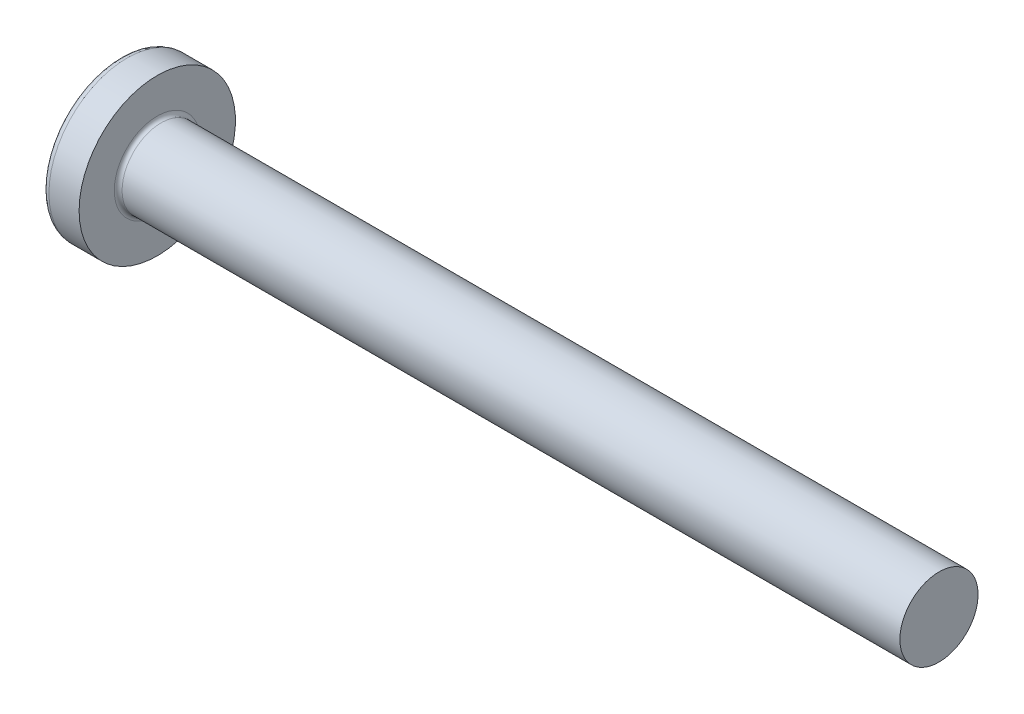
ISO-10303-21;
HEADER;
FILE_DESCRIPTION(('STEP AP214'),'2;1');
FILE_NAME('part.step','',(''),(''),'','','');
FILE_SCHEMA(('AUTOMOTIVE_DESIGN { 1 0 10303 214 1 1 1 1 }'));
ENDSEC;
DATA;
#1=APPLICATION_CONTEXT('core data for automotive mechanical design processes');
#2=APPLICATION_PROTOCOL_DEFINITION('international standard','automotive_design',2000,#1);
#3=PRODUCT_CONTEXT('',#1,'mechanical');
#4=PRODUCT('Part','Part','',(#3));
#5=PRODUCT_RELATED_PRODUCT_CATEGORY('part','',(#4));
#6=PRODUCT_DEFINITION_FORMATION('','',#4);
#7=PRODUCT_DEFINITION_CONTEXT('part definition',#1,'design');
#8=PRODUCT_DEFINITION('design','',#6,#7);
#9=PRODUCT_DEFINITION_SHAPE('','',#8);
#10=(LENGTH_UNIT() NAMED_UNIT(*) SI_UNIT(.MILLI.,.METRE.));
#11=(NAMED_UNIT(*) PLANE_ANGLE_UNIT() SI_UNIT($,.RADIAN.));
#12=(NAMED_UNIT(*) SI_UNIT($,.STERADIAN.) SOLID_ANGLE_UNIT());
#13=UNCERTAINTY_MEASURE_WITH_UNIT(LENGTH_MEASURE(1.E-05),#10,'distance_accuracy_value','');
#14=(GEOMETRIC_REPRESENTATION_CONTEXT(3) GLOBAL_UNCERTAINTY_ASSIGNED_CONTEXT((#13)) GLOBAL_UNIT_ASSIGNED_CONTEXT((#10,
#11,#12)) REPRESENTATION_CONTEXT('',''));
#15=CARTESIAN_POINT('',(0.,0.,0.));
#16=DIRECTION('',(0.,0.,1.));
#17=DIRECTION('',(1.,0.,0.));
#18=AXIS2_PLACEMENT_3D('',#15,#16,#17);
#19=CARTESIAN_POINT('',(6.5,0.,0.));
#20=DIRECTION('',(-1.,0.,0.));
#21=DIRECTION('',(0.,1.,0.));
#22=AXIS2_PLACEMENT_3D('',#19,#20,#21);
#23=SPHERICAL_SURFACE('',#22,6.5);
#24=CARTESIAN_POINT('',(1.26538895452803,0.,0.));
#25=DIRECTION('',(-1.,0.,0.));
#26=DIRECTION('',(0.,0.,1.));
#27=AXIS2_PLACEMENT_3D('',#24,#25,#26);
#28=CIRCLE('',#27,3.85342019543974);
#29=CARTESIAN_POINT('',(1.26538895452803,0.,3.85342019543974));
#30=VERTEX_POINT('',#29);
#31=EDGE_CURVE('E214',#30,#30,#28,.T.);
#32=ORIENTED_EDGE('',*,*,#31,.T.);
#33=EDGE_LOOP('',(#32));
#34=FACE_BOUND('',#33,.T.);
#35=CARTESIAN_POINT('',(0.0788099820016241,0.,0.));
#36=DIRECTION('',(1.,0.,0.));
#37=DIRECTION('',(0.,0.,-1.));
#38=AXIS2_PLACEMENT_3D('',#35,#36,#37);
#39=CIRCLE('',#38,1.0091178091571);
#40=CARTESIAN_POINT('',(0.0788099820016251,-0.514999999999997,-0.867809744562727));
#41=VERTEX_POINT('',#40);
#42=CARTESIAN_POINT('',(0.0788099820016241,-0.867809744562722,-0.515));
#43=VERTEX_POINT('',#42);
#44=EDGE_CURVE('E341',#41,#43,#39,.F.);
#45=ORIENTED_EDGE('',*,*,#44,.F.);
#46=CARTESIAN_POINT('',(6.5,-0.515,0.));
#47=DIRECTION('',(0.,1.,0.));
#48=DIRECTION('',(0.,0.,1.));
#49=AXIS2_PLACEMENT_3D('',#46,#47,#48);
#50=CIRCLE('',#49,6.47956595768575);
#51=CARTESIAN_POINT('',(0.331830520157854,-0.514999999999993,-1.98455543332603));
#52=VERTEX_POINT('',#51);
#53=EDGE_CURVE('E274',#52,#41,#50,.T.);
#54=ORIENTED_EDGE('',*,*,#53,.F.);
#55=CARTESIAN_POINT('',(6.06443225879603,0.,0.873613881878153));
#56=DIRECTION('',(0.446197753347436,0.,-0.894934391398443));
#57=DIRECTION('',(-0.894934391398442,0.,-0.446197753347436));
#58=AXIS2_PLACEMENT_3D('',#55,#56,#57);
#59=CIRCLE('',#58,6.42628038045433);
#60=CARTESIAN_POINT('',(0.331830520157854,0.515000000000007,-1.98455543332603));
#61=VERTEX_POINT('',#60);
#62=EDGE_CURVE('E248',#52,#61,#59,.T.);
#63=ORIENTED_EDGE('',*,*,#62,.T.);
#64=CARTESIAN_POINT('',(6.5,0.515,0.));
#65=DIRECTION('',(0.,-1.,0.));
#66=DIRECTION('',(0.,0.,-1.));
#67=AXIS2_PLACEMENT_3D('',#64,#65,#66);
#68=CIRCLE('',#67,6.47956595768575);
#69=CARTESIAN_POINT('',(0.0788099820016249,0.515000000000003,-0.867809744562724));
#70=VERTEX_POINT('',#69);
#71=EDGE_CURVE('E303',#70,#61,#68,.T.);
#72=ORIENTED_EDGE('',*,*,#71,.F.);
#73=CARTESIAN_POINT('',(0.0788099820016241,0.867809744562721,-0.515));
#74=VERTEX_POINT('',#73);
#75=EDGE_CURVE('E356',#74,#70,#39,.F.);
#76=ORIENTED_EDGE('',*,*,#75,.F.);
#77=CARTESIAN_POINT('',(6.5,0.,-0.515));
#78=DIRECTION('',(0.,0.,1.));
#79=DIRECTION('',(1.,0.,0.));
#80=AXIS2_PLACEMENT_3D('',#77,#78,#79);
#81=CIRCLE('',#80,6.47956595768575);
#82=CARTESIAN_POINT('',(0.331830520157856,1.98455543332603,-0.515));
#83=VERTEX_POINT('',#82);
#84=EDGE_CURVE('E242',#83,#74,#81,.T.);
#85=ORIENTED_EDGE('',*,*,#84,.F.);
#86=CARTESIAN_POINT('',(6.06443225879604,-0.873613881878154,0.));
#87=DIRECTION('',(0.446197753347436,0.894934391398443,0.));
#88=DIRECTION('',(-0.894934391398442,0.446197753347436,0.));
#89=AXIS2_PLACEMENT_3D('',#86,#87,#88);
#90=CIRCLE('',#89,6.42628038045433);
#91=CARTESIAN_POINT('',(0.331830520157856,1.98455543332603,0.515));
#92=VERTEX_POINT('',#91);
#93=EDGE_CURVE('E245',#83,#92,#90,.T.);
#94=ORIENTED_EDGE('',*,*,#93,.T.);
#95=CARTESIAN_POINT('',(6.5,0.,0.515));
#96=DIRECTION('',(0.,0.,-1.));
#97=DIRECTION('',(0.,1.,0.));
#98=AXIS2_PLACEMENT_3D('',#95,#96,#97);
#99=CIRCLE('',#98,6.47956595768575);
#100=CARTESIAN_POINT('',(0.0788099820016241,0.867809744562721,0.515));
#101=VERTEX_POINT('',#100);
#102=EDGE_CURVE('E238',#101,#92,#99,.T.);
#103=ORIENTED_EDGE('',*,*,#102,.F.);
#104=CARTESIAN_POINT('',(0.0788099820016251,0.514999999999997,0.867809744562727));
#105=VERTEX_POINT('',#104);
#106=EDGE_CURVE('E355',#105,#101,#39,.F.);
#107=ORIENTED_EDGE('',*,*,#106,.F.);
#108=CARTESIAN_POINT('',(0.331830520157856,0.514999999999993,1.98455543332603));
#109=VERTEX_POINT('',#108);
#110=EDGE_CURVE('E258',#109,#105,#68,.T.);
#111=ORIENTED_EDGE('',*,*,#110,.F.);
#112=CARTESIAN_POINT('',(6.06443225879603,0.,-0.873613881878153));
#113=DIRECTION('',(0.446197753347436,0.,0.894934391398443));
#114=DIRECTION('',(0.894934391398442,0.,-0.446197753347436));
#115=AXIS2_PLACEMENT_3D('',#112,#113,#114);
#116=CIRCLE('',#115,6.42628038045433);
#117=CARTESIAN_POINT('',(0.331830520157856,-0.515000000000007,1.98455543332603));
#118=VERTEX_POINT('',#117);
#119=EDGE_CURVE('E49',#109,#118,#116,.T.);
#120=ORIENTED_EDGE('',*,*,#119,.T.);
#121=CARTESIAN_POINT('',(0.0788099820016253,-0.515000000000003,0.867809744562724));
#122=VERTEX_POINT('',#121);
#123=EDGE_CURVE('E255',#122,#118,#50,.T.);
#124=ORIENTED_EDGE('',*,*,#123,.F.);
#125=CARTESIAN_POINT('',(0.0788099820016241,-0.867809744562722,0.515));
#126=VERTEX_POINT('',#125);
#127=EDGE_CURVE('E391',#126,#122,#39,.F.);
#128=ORIENTED_EDGE('',*,*,#127,.F.);
#129=CARTESIAN_POINT('',(0.331830520157854,-1.98455543332603,0.515));
#130=VERTEX_POINT('',#129);
#131=EDGE_CURVE('E239',#130,#126,#99,.T.);
#132=ORIENTED_EDGE('',*,*,#131,.F.);
#133=CARTESIAN_POINT('',(6.06443225879603,0.873613881878153,0.));
#134=DIRECTION('',(0.446197753347436,-0.894934391398443,0.));
#135=DIRECTION('',(0.894934391398442,0.446197753347436,0.));
#136=AXIS2_PLACEMENT_3D('',#133,#134,#135);
#137=CIRCLE('',#136,6.42628038045433);
#138=CARTESIAN_POINT('',(0.331830520157854,-1.98455543332603,-0.515));
#139=VERTEX_POINT('',#138);
#140=EDGE_CURVE('E235',#130,#139,#137,.T.);
#141=ORIENTED_EDGE('',*,*,#140,.T.);
#142=EDGE_CURVE('E64',#43,#139,#81,.T.);
#143=ORIENTED_EDGE('',*,*,#142,.F.);
#144=EDGE_LOOP('',(#45,#54,#63,#72,#76,#85,#94,#103,#107,#111,#120,#124,#128,#132,#141,#143));
#145=FACE_BOUND('',#144,.T.);
#146=ADVANCED_FACE('F35',(#34,#145),#23,.T.);
#147=CARTESIAN_POINT('',(0.,2.15,-0.515));
#148=DIRECTION('',(0.,0.,1.));
#149=DIRECTION('',(1.,0.,0.));
#150=AXIS2_PLACEMENT_3D('',#147,#148,#149);
#151=PLANE('',#150);
#152=ORIENTED_EDGE('',*,*,#84,.T.);
#153=CARTESIAN_POINT('',(-1.51195208675156,0.994972220320187,-0.515));
#154=CARTESIAN_POINT('',(-1.20405981949279,0.970722016949957,-0.515));
#155=CARTESIAN_POINT('',(-0.896180907521174,0.94629910991965,-0.515));
#156=CARTESIAN_POINT('',(-0.280449079832185,0.896981122427851,-0.515));
#157=CARTESIAN_POINT('',(0.0274038344396872,0.872086023934882,-0.515));
#158=CARTESIAN_POINT('',(0.489146739515351,0.83429553519528,-0.515));
#159=CARTESIAN_POINT('',(0.643055047553846,0.821624058404092,-0.515));
#160=CARTESIAN_POINT('',(0.950856520197141,0.796108332639504,-0.515));
#161=CARTESIAN_POINT('',(1.10474968487868,0.783264084592465,-0.515));
#162=CARTESIAN_POINT('',(1.41251352095103,0.757376569093378,-0.515));
#163=CARTESIAN_POINT('',(1.56638419296577,0.744333309065218,-0.515));
#164=CARTESIAN_POINT('',(1.87410847343335,0.718013273188896,-0.515));
#165=CARTESIAN_POINT('',(2.02796208151372,0.704736492982792,-0.515));
#166=CARTESIAN_POINT('',(2.36455311890989,0.675386943006726,-0.515));
#167=CARTESIAN_POINT('',(2.54728562293342,0.659257575640986,-0.515));
#168=CARTESIAN_POINT('',(2.91270624109256,0.626517182479888,-0.515));
#169=CARTESIAN_POINT('',(3.09539435554037,0.609906160177238,-0.515));
#170=CARTESIAN_POINT('',(3.46069832191612,0.576073027116422,-0.515));
#171=CARTESIAN_POINT('',(3.64331417870068,0.558850968932728,-0.515));
#172=CARTESIAN_POINT('',(4.00847437496567,0.523604864540038,-0.515));
#173=CARTESIAN_POINT('',(4.19101871216888,0.505580794604253,-0.515));
#174=CARTESIAN_POINT('',(4.55606208157937,0.468429191666488,-0.515));
#175=CARTESIAN_POINT('',(4.73856107358022,0.449301262281854,-0.515));
#176=CARTESIAN_POINT('',(5.10337547353418,0.409473604748925,-0.515));
#177=CARTESIAN_POINT('',(5.28569089526422,0.38877400510607,-0.515));
#178=CARTESIAN_POINT('',(5.55897278495412,0.355828287527265,-0.515));
#179=CARTESIAN_POINT('',(5.65005277419686,0.344527918782739,-0.515));
#180=CARTESIAN_POINT('',(5.83209904103607,0.321075174263032,-0.515));
#181=CARTESIAN_POINT('',(5.92306532397915,0.308922840209687,-0.515));
#182=CARTESIAN_POINT('',(6.10486078872898,0.283427334451931,-0.515));
#183=CARTESIAN_POINT('',(6.19568992299379,0.270083817601715,-0.515));
#184=CARTESIAN_POINT('',(6.33172773785679,0.248701420809952,-0.515));
#185=CARTESIAN_POINT('',(6.37704304473344,0.241345446705305,-0.515));
#186=CARTESIAN_POINT('',(6.4675722520141,0.226018953559339,-0.515));
#187=CARTESIAN_POINT('',(6.51278614568083,0.218048394864477,-0.515));
#188=CARTESIAN_POINT('',(6.55793125759548,0.209691465274946,-0.515));
#189=B_SPLINE_CURVE_WITH_KNOTS('',3,(#153,#154,#155,#156,#157,#158,#159,#160,#161,#162,#163,
#164,#165,#166,#167,#168,#169,#170,#171,#172,#173,#174,#175,#176,#177,#178,#179,#180,#181,#182,
#183,#184,#185,#186,#187,#188),.UNSPECIFIED.,.F.,.F.,(4,2,2,2,2,2,2,2,2,2,2,2,2,2,2,2,2,4),(0.,
0.92653770978172,1.85311087258339,2.31639796016285,2.77968256468771,3.24294992902054,
3.70622594801777,4.25655436065378,4.80687878359543,5.35715597005738,5.90744944680717,
6.45794177197673,7.00838913527399,7.28372117336898,7.55903973750591,7.83443833587748,
7.97216007460854,8.10989070671571),.UNSPECIFIED.);
#190=CARTESIAN_POINT('',(2.34,0.677477674908923,-0.515));
#191=VERTEX_POINT('',#190);
#192=EDGE_CURVE('E378',#74,#191,#189,.T.);
#193=ORIENTED_EDGE('',*,*,#192,.T.);
#194=DIRECTION('',(0.,1.,0.));
#195=VECTOR('',#194,1.);
#196=CARTESIAN_POINT('',(2.34,-0.983319232260742,-0.515));
#197=LINE('',#196,#195);
#198=CARTESIAN_POINT('',(2.34,0.983319232260743,-0.515));
#199=VERTEX_POINT('',#198);
#200=EDGE_CURVE('E324',#191,#199,#197,.T.);
#201=ORIENTED_EDGE('',*,*,#200,.T.);
#202=DIRECTION('',(0.894934391398442,-0.446197753347436,0.));
#203=VECTOR('',#202,1.);
#204=CARTESIAN_POINT('',(0.,2.15,-0.515));
#205=LINE('',#204,#203);
#206=EDGE_CURVE('E215',#83,#199,#205,.T.);
#207=ORIENTED_EDGE('',*,*,#206,.F.);
#208=EDGE_LOOP('',(#152,#193,#201,#207));
#209=FACE_BOUND('',#208,.T.);
#210=ADVANCED_FACE('F170',(#209),#151,.T.);
#211=CARTESIAN_POINT('',(2.34,-0.983319232260742,-0.515));
#212=VERTEX_POINT('',#211);
#213=CARTESIAN_POINT('',(2.34,-0.677477674908923,-0.515));
#214=VERTEX_POINT('',#213);
#215=EDGE_CURVE('E223',#212,#214,#197,.T.);
#216=ORIENTED_EDGE('',*,*,#215,.T.);
#217=CARTESIAN_POINT('',(-1.51195208675156,-0.994972220320187,-0.515));
#218=CARTESIAN_POINT('',(-1.20405981949279,-0.970722016949957,-0.515));
#219=CARTESIAN_POINT('',(-0.896180907521174,-0.94629910991965,-0.515));
#220=CARTESIAN_POINT('',(-0.280449079832185,-0.896981122427851,-0.515));
#221=CARTESIAN_POINT('',(0.0274038344396872,-0.872086023934882,-0.515));
#222=CARTESIAN_POINT('',(0.489146739515351,-0.83429553519528,-0.515));
#223=CARTESIAN_POINT('',(0.643055047553846,-0.821624058404092,-0.515));
#224=CARTESIAN_POINT('',(0.950856520197141,-0.796108332639504,-0.515));
#225=CARTESIAN_POINT('',(1.10474968487868,-0.783264084592465,-0.515));
#226=CARTESIAN_POINT('',(1.41251352095103,-0.757376569093378,-0.515));
#227=CARTESIAN_POINT('',(1.56638419296577,-0.744333309065218,-0.515));
#228=CARTESIAN_POINT('',(1.87410847343335,-0.718013273188896,-0.515));
#229=CARTESIAN_POINT('',(2.02796208151372,-0.704736492982792,-0.515));
#230=CARTESIAN_POINT('',(2.36455311890989,-0.675386943006726,-0.515));
#231=CARTESIAN_POINT('',(2.54728562293342,-0.659257575640986,-0.515));
#232=CARTESIAN_POINT('',(2.91270624109256,-0.626517182479888,-0.515));
#233=CARTESIAN_POINT('',(3.09539435554038,-0.609906160177238,-0.515));
#234=CARTESIAN_POINT('',(3.46069832191613,-0.576073027116421,-0.515));
#235=CARTESIAN_POINT('',(3.64331417870068,-0.558850968932727,-0.515));
#236=CARTESIAN_POINT('',(4.00847437496567,-0.523604864540037,-0.515));
#237=CARTESIAN_POINT('',(4.19101871216888,-0.505580794604253,-0.515));
#238=CARTESIAN_POINT('',(4.55606208157937,-0.468429191666488,-0.515));
#239=CARTESIAN_POINT('',(4.73856107358023,-0.449301262281854,-0.515));
#240=CARTESIAN_POINT('',(5.10337547353419,-0.409473604748925,-0.515));
#241=CARTESIAN_POINT('',(5.28569089526422,-0.38877400510607,-0.515));
#242=CARTESIAN_POINT('',(5.55897278495412,-0.355828287527264,-0.515));
#243=CARTESIAN_POINT('',(5.65005277419686,-0.344527918782738,-0.515));
#244=CARTESIAN_POINT('',(5.83209904103608,-0.321075174263031,-0.515));
#245=CARTESIAN_POINT('',(5.92306532397915,-0.308922840209686,-0.515));
#246=CARTESIAN_POINT('',(6.10486078872898,-0.283427334451931,-0.515));
#247=CARTESIAN_POINT('',(6.1956899229938,-0.270083817601715,-0.515));
#248=CARTESIAN_POINT('',(6.33172773785679,-0.248701420809952,-0.515));
#249=CARTESIAN_POINT('',(6.37704304473344,-0.241345446705305,-0.515));
#250=CARTESIAN_POINT('',(6.4675722520141,-0.226018953559339,-0.515));
#251=CARTESIAN_POINT('',(6.51278614568083,-0.218048394864477,-0.515));
#252=CARTESIAN_POINT('',(6.55793125759549,-0.209691465274945,-0.515));
#253=B_SPLINE_CURVE_WITH_KNOTS('',3,(#217,#218,#219,#220,#221,#222,#223,#224,#225,#226,#227,
#228,#229,#230,#231,#232,#233,#234,#235,#236,#237,#238,#239,#240,#241,#242,#243,#244,#245,#246,
#247,#248,#249,#250,#251,#252),.UNSPECIFIED.,.F.,.F.,(4,2,2,2,2,2,2,2,2,2,2,2,2,2,2,2,2,4),(0.,
0.92653770978172,1.85311087258339,2.31639796016285,2.77968256468771,3.24294992902054,
3.70622594801777,4.25655436065378,4.80687878359543,5.35715597005738,5.90744944680718,
6.45794177197673,7.008389135274,7.28372117336899,7.55903973750591,7.83443833587748,
7.97216007460854,8.10989070671571),.UNSPECIFIED.);
#254=EDGE_CURVE('E354',#214,#43,#253,.F.);
#255=ORIENTED_EDGE('',*,*,#254,.T.);
#256=ORIENTED_EDGE('',*,*,#142,.T.);
#257=DIRECTION('',(0.894934391398442,0.446197753347436,0.));
#258=VECTOR('',#257,1.);
#259=CARTESIAN_POINT('',(0.,-2.15,-0.515));
#260=LINE('',#259,#258);
#261=EDGE_CURVE('E306',#139,#212,#260,.T.);
#262=ORIENTED_EDGE('',*,*,#261,.T.);
#263=EDGE_LOOP('',(#216,#255,#256,#262));
#264=FACE_BOUND('',#263,.T.);
#265=ADVANCED_FACE('F176',(#264),#151,.T.);
#266=CARTESIAN_POINT('',(0.,-2.15,0.515));
#267=DIRECTION('',(0.,0.,-1.));
#268=DIRECTION('',(0.,1.,0.));
#269=AXIS2_PLACEMENT_3D('',#266,#267,#268);
#270=PLANE('',#269);
#271=DIRECTION('',(0.,-1.,0.));
#272=VECTOR('',#271,1.);
#273=CARTESIAN_POINT('',(2.34,0.983319232260742,0.515));
#274=LINE('',#273,#272);
#275=CARTESIAN_POINT('',(2.34,0.983319232260743,0.515));
#276=VERTEX_POINT('',#275);
#277=CARTESIAN_POINT('',(2.34,0.677477674908923,0.515));
#278=VERTEX_POINT('',#277);
#279=EDGE_CURVE('E314',#276,#278,#274,.T.);
#280=ORIENTED_EDGE('',*,*,#279,.T.);
#281=CARTESIAN_POINT('',(-1.51195208754037,0.994972220382297,0.515));
#282=CARTESIAN_POINT('',(-1.20405982018868,0.970722017005064,0.515));
#283=CARTESIAN_POINT('',(-0.896180908124144,0.946299109967688,0.515));
#284=CARTESIAN_POINT('',(-0.280449080249312,0.896981122461527,0.515));
#285=CARTESIAN_POINT('',(0.0274038341154851,0.872086023961265,0.515));
#286=CARTESIAN_POINT('',(0.489146739371409,0.834295535207136,0.515));
#287=CARTESIAN_POINT('',(0.643055047497245,0.821624058408796,0.515));
#288=CARTESIAN_POINT('',(0.950856520315204,0.796108332629705,0.515));
#289=CARTESIAN_POINT('',(1.10474968508407,0.783264084575317,0.515));
#290=CARTESIAN_POINT('',(1.41251352133103,0.757376569061287,0.515));
#291=CARTESIAN_POINT('',(1.56638419343305,0.744333309025534,0.515));
#292=CARTESIAN_POINT('',(1.87410847407519,0.718013273133716,0.515));
#293=CARTESIAN_POINT('',(2.02796208224283,0.70473649291971,0.515));
#294=CARTESIAN_POINT('',(2.36455311972626,0.675386942934956,0.515));
#295=CARTESIAN_POINT('',(2.5472856237498,0.659257575568568,0.515));
#296=CARTESIAN_POINT('',(2.91270624190895,0.626517182406014,0.515));
#297=CARTESIAN_POINT('',(3.09539435635676,0.609906160102555,0.515));
#298=CARTESIAN_POINT('',(3.46069832273244,0.57607302703989,0.515));
#299=CARTESIAN_POINT('',(3.64331417951694,0.558850968855157,0.515));
#300=CARTESIAN_POINT('',(4.00847437578178,0.523604864460044,0.515));
#301=CARTESIAN_POINT('',(4.1910187129849,0.505580794522876,0.515));
#302=CARTESIAN_POINT('',(4.55606208239526,0.46842919158178,0.515));
#303=CARTESIAN_POINT('',(4.73856107439606,0.449301262195198,0.515));
#304=CARTESIAN_POINT('',(5.10337547434977,0.409473604657436,0.515));
#305=CARTESIAN_POINT('',(5.2856908960796,0.388774005011695,0.515));
#306=CARTESIAN_POINT('',(5.55897278576906,0.355828287427083,0.515));
#307=CARTESIAN_POINT('',(5.65005277501166,0.344527918680369,0.515));
#308=CARTESIAN_POINT('',(5.83209904185046,0.321075174155501,0.515));
#309=CARTESIAN_POINT('',(5.92306532479326,0.308922840099182,0.515));
#310=CARTESIAN_POINT('',(6.10486078954238,0.283427334334154,0.515));
#311=CARTESIAN_POINT('',(6.19568992380676,0.270083817479638,0.515));
#312=CARTESIAN_POINT('',(6.33172773866873,0.24870142067948,0.515));
#313=CARTESIAN_POINT('',(6.37704304554499,0.241345446571708,0.515));
#314=CARTESIAN_POINT('',(6.46757225282465,0.226018953418425,0.515));
#315=CARTESIAN_POINT('',(6.51278614649077,0.21804839471937,0.515));
#316=CARTESIAN_POINT('',(6.55793125840465,0.209691465124903,0.515));
#317=B_SPLINE_CURVE_WITH_KNOTS('',3,(#281,#282,#283,#284,#285,#286,#287,#288,#289,#290,#291,
#292,#293,#294,#295,#296,#297,#298,#299,#300,#301,#302,#303,#304,#305,#306,#307,#308,#309,#310,
#311,#312,#313,#314,#315,#316),.UNSPECIFIED.,.F.,.F.,(4,2,2,2,2,2,2,2,2,2,2,2,2,2,2,2,2,4),(0.,
0.926537710061277,1.85311087314258,2.31639796098494,2.77968256577269,3.24294993036838,
3.70622594962848,4.25655436226469,4.80687878520654,5.3571559716686,5.90744944841854,
6.45794177358856,7.00838913688618,7.28372117498156,7.55903973911884,7.83443833749096,
7.97216007622235,8.10989070832989),.UNSPECIFIED.);
#318=EDGE_CURVE('E279',#278,#101,#317,.F.);
#319=ORIENTED_EDGE('',*,*,#318,.T.);
#320=ORIENTED_EDGE('',*,*,#102,.T.);
#321=DIRECTION('',(0.894934391398442,-0.446197753347436,0.));
#322=VECTOR('',#321,1.);
#323=CARTESIAN_POINT('',(0.,2.15,0.515));
#324=LINE('',#323,#322);
#325=EDGE_CURVE('E220',#92,#276,#324,.T.);
#326=ORIENTED_EDGE('',*,*,#325,.T.);
#327=EDGE_LOOP('',(#280,#319,#320,#326));
#328=FACE_BOUND('',#327,.T.);
#329=ADVANCED_FACE('F374',(#328),#270,.T.);
#330=ORIENTED_EDGE('',*,*,#131,.T.);
#331=CARTESIAN_POINT('',(-1.51195208754037,-0.994972220382297,0.515));
#332=CARTESIAN_POINT('',(-1.20405982018868,-0.970722017005064,0.515));
#333=CARTESIAN_POINT('',(-0.896180908124144,-0.946299109967688,0.515));
#334=CARTESIAN_POINT('',(-0.280449080249312,-0.896981122461527,0.515));
#335=CARTESIAN_POINT('',(0.0274038341154852,-0.872086023961264,0.515));
#336=CARTESIAN_POINT('',(0.489146739371408,-0.834295535207136,0.515));
#337=CARTESIAN_POINT('',(0.643055047497245,-0.821624058408796,0.515));
#338=CARTESIAN_POINT('',(0.950856520315204,-0.796108332629705,0.515));
#339=CARTESIAN_POINT('',(1.10474968508407,-0.783264084575317,0.515));
#340=CARTESIAN_POINT('',(1.41251352133103,-0.757376569061287,0.515));
#341=CARTESIAN_POINT('',(1.56638419343305,-0.744333309025534,0.515));
#342=CARTESIAN_POINT('',(1.87410847407519,-0.718013273133716,0.515));
#343=CARTESIAN_POINT('',(2.02796208224283,-0.70473649291971,0.515));
#344=CARTESIAN_POINT('',(2.36455311972626,-0.675386942934956,0.515));
#345=CARTESIAN_POINT('',(2.5472856237498,-0.659257575568568,0.515));
#346=CARTESIAN_POINT('',(2.91270624190895,-0.626517182406014,0.515));
#347=CARTESIAN_POINT('',(3.09539435635676,-0.609906160102555,0.515));
#348=CARTESIAN_POINT('',(3.46069832273244,-0.57607302703989,0.515));
#349=CARTESIAN_POINT('',(3.64331417951694,-0.558850968855157,0.515));
#350=CARTESIAN_POINT('',(4.00847437578178,-0.523604864460045,0.515));
#351=CARTESIAN_POINT('',(4.1910187129849,-0.505580794522877,0.515));
#352=CARTESIAN_POINT('',(4.55606208239525,-0.46842919158178,0.515));
#353=CARTESIAN_POINT('',(4.73856107439606,-0.449301262195199,0.515));
#354=CARTESIAN_POINT('',(5.10337547434977,-0.409473604657436,0.515));
#355=CARTESIAN_POINT('',(5.2856908960796,-0.388774005011696,0.515));
#356=CARTESIAN_POINT('',(5.55897278576906,-0.355828287427083,0.515));
#357=CARTESIAN_POINT('',(5.65005277501166,-0.34452791868037,0.515));
#358=CARTESIAN_POINT('',(5.83209904185046,-0.321075174155501,0.515));
#359=CARTESIAN_POINT('',(5.92306532479326,-0.308922840099182,0.515));
#360=CARTESIAN_POINT('',(6.10486078954238,-0.283427334334154,0.515));
#361=CARTESIAN_POINT('',(6.19568992380675,-0.270083817479639,0.515));
#362=CARTESIAN_POINT('',(6.33172773866873,-0.24870142067948,0.515));
#363=CARTESIAN_POINT('',(6.37704304554499,-0.241345446571709,0.515));
#364=CARTESIAN_POINT('',(6.46757225282465,-0.226018953418425,0.515));
#365=CARTESIAN_POINT('',(6.51278614649077,-0.21804839471937,0.515));
#366=CARTESIAN_POINT('',(6.55793125840465,-0.209691465124903,0.515));
#367=B_SPLINE_CURVE_WITH_KNOTS('',3,(#331,#332,#333,#334,#335,#336,#337,#338,#339,#340,#341,
#342,#343,#344,#345,#346,#347,#348,#349,#350,#351,#352,#353,#354,#355,#356,#357,#358,#359,#360,
#361,#362,#363,#364,#365,#366),.UNSPECIFIED.,.F.,.F.,(4,2,2,2,2,2,2,2,2,2,2,2,2,2,2,2,2,4),(0.,
0.926537710061277,1.85311087314258,2.31639796098494,2.77968256577269,3.24294993036838,
3.70622594962848,4.25655436226469,4.80687878520654,5.3571559716686,5.90744944841854,
6.45794177358856,7.00838913688618,7.28372117498156,7.55903973911884,7.83443833749095,
7.97216007622235,8.10989070832989),.UNSPECIFIED.);
#368=CARTESIAN_POINT('',(2.34,-0.677477674908923,0.515));
#369=VERTEX_POINT('',#368);
#370=EDGE_CURVE('E392',#126,#369,#367,.T.);
#371=ORIENTED_EDGE('',*,*,#370,.T.);
#372=CARTESIAN_POINT('',(2.34,-0.983319232260742,0.515));
#373=VERTEX_POINT('',#372);
#374=EDGE_CURVE('E316',#369,#373,#274,.T.);
#375=ORIENTED_EDGE('',*,*,#374,.T.);
#376=DIRECTION('',(0.894934391398442,0.446197753347436,0.));
#377=VECTOR('',#376,1.);
#378=CARTESIAN_POINT('',(0.,-2.15,0.515));
#379=LINE('',#378,#377);
#380=EDGE_CURVE('E308',#130,#373,#379,.T.);
#381=ORIENTED_EDGE('',*,*,#380,.F.);
#382=EDGE_LOOP('',(#330,#371,#375,#381));
#383=FACE_BOUND('',#382,.T.);
#384=ADVANCED_FACE('F422',(#383),#270,.T.);
#385=CARTESIAN_POINT('',(2.34,0.983319232260742,-0.515));
#386=DIRECTION('',(-1.,0.,0.));
#387=DIRECTION('',(0.,0.,1.));
#388=AXIS2_PLACEMENT_3D('',#385,#386,#387);
#389=PLANE('',#388);
#390=ORIENTED_EDGE('',*,*,#374,.F.);
#391=CARTESIAN_POINT('',(2.34,0.,0.));
#392=DIRECTION('',(-1.,0.,0.));
#393=DIRECTION('',(0.,0.,1.));
#394=AXIS2_PLACEMENT_3D('',#391,#392,#393);
#395=CIRCLE('',#394,0.851);
#396=EDGE_CURVE('E349',#214,#369,#395,.T.);
#397=ORIENTED_EDGE('',*,*,#396,.F.);
#398=ORIENTED_EDGE('',*,*,#215,.F.);
#399=DIRECTION('',(0.,0.,1.));
#400=VECTOR('',#399,1.);
#401=CARTESIAN_POINT('',(2.34,-0.983319232260742,-0.515));
#402=LINE('',#401,#400);
#403=EDGE_CURVE('E311',#212,#373,#402,.T.);
#404=ORIENTED_EDGE('',*,*,#403,.T.);
#405=EDGE_LOOP('',(#390,#397,#398,#404));
#406=FACE_BOUND('',#405,.T.);
#407=ADVANCED_FACE('F415',(#406),#389,.T.);
#408=DIRECTION('',(0.,0.,-1.));
#409=VECTOR('',#408,1.);
#410=CARTESIAN_POINT('',(2.34,-0.515000000000004,0.983319232260741));
#411=LINE('',#410,#409);
#412=CARTESIAN_POINT('',(2.34,-0.514999999999998,-0.677477674908925));
#413=VERTEX_POINT('',#412);
#414=CARTESIAN_POINT('',(2.34,-0.514999999999996,-0.983319232260744));
#415=VERTEX_POINT('',#414);
#416=EDGE_CURVE('E297',#413,#415,#411,.T.);
#417=ORIENTED_EDGE('',*,*,#416,.F.);
#418=CARTESIAN_POINT('',(2.34,0.515000000000002,-0.677477674908921));
#419=VERTEX_POINT('',#418);
#420=EDGE_CURVE('E56',#419,#413,#395,.T.);
#421=ORIENTED_EDGE('',*,*,#420,.F.);
#422=DIRECTION('',(0.,0.,1.));
#423=VECTOR('',#422,1.);
#424=CARTESIAN_POINT('',(2.34,0.515000000000004,-0.983319232260741));
#425=LINE('',#424,#423);
#426=CARTESIAN_POINT('',(2.34,0.515000000000004,-0.983319232260741));
#427=VERTEX_POINT('',#426);
#428=EDGE_CURVE('E300',#427,#419,#425,.T.);
#429=ORIENTED_EDGE('',*,*,#428,.F.);
#430=DIRECTION('',(0.,-1.,0.));
#431=VECTOR('',#430,1.);
#432=CARTESIAN_POINT('',(2.34,0.515000000000004,-0.983319232260741));
#433=LINE('',#432,#431);
#434=EDGE_CURVE('E291',#427,#415,#433,.T.);
#435=ORIENTED_EDGE('',*,*,#434,.T.);
#436=EDGE_LOOP('',(#417,#421,#429,#435));
#437=FACE_BOUND('',#436,.T.);
#438=ADVANCED_FACE('F344',(#437),#389,.T.);
#439=ORIENTED_EDGE('',*,*,#200,.F.);
#440=EDGE_CURVE('E348',#278,#191,#395,.T.);
#441=ORIENTED_EDGE('',*,*,#440,.F.);
#442=ORIENTED_EDGE('',*,*,#279,.F.);
#443=DIRECTION('',(0.,0.,-1.));
#444=VECTOR('',#443,1.);
#445=CARTESIAN_POINT('',(2.34,0.983319232260742,0.515));
#446=LINE('',#445,#444);
#447=EDGE_CURVE('E317',#276,#199,#446,.T.);
#448=ORIENTED_EDGE('',*,*,#447,.T.);
#449=EDGE_LOOP('',(#439,#441,#442,#448));
#450=FACE_BOUND('',#449,.T.);
#451=ADVANCED_FACE('F416',(#450),#389,.T.);
#452=CARTESIAN_POINT('',(0.,0.514999999999993,2.15));
#453=DIRECTION('',(0.,-1.,0.));
#454=DIRECTION('',(1.,0.,0.));
#455=AXIS2_PLACEMENT_3D('',#452,#453,#454);
#456=PLANE('',#455);
#457=ORIENTED_EDGE('',*,*,#110,.T.);
#458=CARTESIAN_POINT('',(-1.51195208754037,0.514999999999997,0.994972220382299));
#459=CARTESIAN_POINT('',(-1.20405982018868,0.514999999999997,0.970722017005065));
#460=CARTESIAN_POINT('',(-0.896180908124144,0.514999999999997,0.94629910996769));
#461=CARTESIAN_POINT('',(-0.280449080249312,0.514999999999997,0.896981122461529));
#462=CARTESIAN_POINT('',(0.0274038341154852,0.514999999999997,0.872086023961266));
#463=CARTESIAN_POINT('',(0.489146739371409,0.514999999999997,0.834295535207138));
#464=CARTESIAN_POINT('',(0.643055047497245,0.514999999999997,0.821624058408797));
#465=CARTESIAN_POINT('',(0.950856520315204,0.514999999999997,0.796108332629707));
#466=CARTESIAN_POINT('',(1.10474968508407,0.514999999999997,0.783264084575319));
#467=CARTESIAN_POINT('',(1.41251352133103,0.514999999999997,0.757376569061289));
#468=CARTESIAN_POINT('',(1.56638419343305,0.514999999999997,0.744333309025535));
#469=CARTESIAN_POINT('',(1.87410847407519,0.514999999999998,0.718013273133717));
#470=CARTESIAN_POINT('',(2.02796208224283,0.514999999999998,0.704736492919711));
#471=CARTESIAN_POINT('',(2.36455311972626,0.514999999999998,0.675386942934957));
#472=CARTESIAN_POINT('',(2.5472856237498,0.514999999999998,0.65925757556857));
#473=CARTESIAN_POINT('',(2.91270624190895,0.514999999999998,0.626517182406016));
#474=CARTESIAN_POINT('',(3.09539435635676,0.514999999999998,0.609906160102557));
#475=CARTESIAN_POINT('',(3.46069832273244,0.514999999999998,0.576073027039891));
#476=CARTESIAN_POINT('',(3.64331417951694,0.514999999999998,0.558850968855159));
#477=CARTESIAN_POINT('',(4.00847437578178,0.514999999999998,0.523604864460046));
#478=CARTESIAN_POINT('',(4.1910187129849,0.514999999999998,0.505580794522878));
#479=CARTESIAN_POINT('',(4.55606208239526,0.514999999999998,0.468429191581782));
#480=CARTESIAN_POINT('',(4.73856107439606,0.514999999999999,0.4493012621952));
#481=CARTESIAN_POINT('',(5.10337547434977,0.514999999999999,0.409473604657437));
#482=CARTESIAN_POINT('',(5.2856908960796,0.514999999999999,0.388774005011697));
#483=CARTESIAN_POINT('',(5.55897278576906,0.514999999999999,0.355828287427085));
#484=CARTESIAN_POINT('',(5.65005277501166,0.514999999999999,0.344527918680371));
#485=CARTESIAN_POINT('',(5.83209904185046,0.514999999999999,0.321075174155502));
#486=CARTESIAN_POINT('',(5.92306532479326,0.514999999999999,0.308922840099184));
#487=CARTESIAN_POINT('',(6.10486078954238,0.514999999999999,0.283427334334156));
#488=CARTESIAN_POINT('',(6.19568992380675,0.514999999999999,0.27008381747964));
#489=CARTESIAN_POINT('',(6.33172773866873,0.514999999999999,0.248701420679482));
#490=CARTESIAN_POINT('',(6.37704304554499,0.514999999999999,0.241345446571711));
#491=CARTESIAN_POINT('',(6.46757225282465,0.514999999999999,0.226018953418427));
#492=CARTESIAN_POINT('',(6.51278614649077,0.514999999999999,0.218048394719372));
#493=CARTESIAN_POINT('',(6.55793125840465,0.514999999999999,0.209691465124905));
#494=B_SPLINE_CURVE_WITH_KNOTS('',3,(#458,#459,#460,#461,#462,#463,#464,#465,#466,#467,#468,
#469,#470,#471,#472,#473,#474,#475,#476,#477,#478,#479,#480,#481,#482,#483,#484,#485,#486,#487,
#488,#489,#490,#491,#492,#493),.UNSPECIFIED.,.F.,.F.,(4,2,2,2,2,2,2,2,2,2,2,2,2,2,2,2,2,4),(0.,
0.926537710061277,1.85311087314258,2.31639796098494,2.77968256577269,3.24294993036838,
3.70622594962848,4.25655436226469,4.80687878520654,5.3571559716686,5.90744944841854,
6.45794177358856,7.00838913688618,7.28372117498156,7.55903973911883,7.83443833749095,
7.97216007622235,8.10989070832989),.UNSPECIFIED.);
#495=CARTESIAN_POINT('',(2.34,0.514999999999998,0.677477674908924));
#496=VERTEX_POINT('',#495);
#497=EDGE_CURVE('E440',#105,#496,#494,.T.);
#498=ORIENTED_EDGE('',*,*,#497,.T.);
#499=CARTESIAN_POINT('',(2.34,0.514999999999997,0.983319232260744));
#500=VERTEX_POINT('',#499);
#501=EDGE_CURVE('E272',#496,#500,#425,.T.);
#502=ORIENTED_EDGE('',*,*,#501,.T.);
#503=DIRECTION('',(0.894934391398442,0.,-0.446197753347436));
#504=VECTOR('',#503,1.);
#505=CARTESIAN_POINT('',(0.,0.514999999999993,2.15));
#506=LINE('',#505,#504);
#507=EDGE_CURVE('E265',#109,#500,#506,.T.);
#508=ORIENTED_EDGE('',*,*,#507,.F.);
#509=EDGE_LOOP('',(#457,#498,#502,#508));
#510=FACE_BOUND('',#509,.T.);
#511=ADVANCED_FACE('F269',(#510),#456,.T.);
#512=CARTESIAN_POINT('',(0.,-0.514999999999992,-2.15));
#513=DIRECTION('',(0.,1.,0.));
#514=DIRECTION('',(0.,0.,1.));
#515=AXIS2_PLACEMENT_3D('',#512,#513,#514);
#516=PLANE('',#515);
#517=CARTESIAN_POINT('',(2.34,-0.515000000000004,0.983319232260741));
#518=VERTEX_POINT('',#517);
#519=CARTESIAN_POINT('',(2.34,-0.515000000000003,0.677477674908921));
#520=VERTEX_POINT('',#519);
#521=EDGE_CURVE('E294',#518,#520,#411,.T.);
#522=ORIENTED_EDGE('',*,*,#521,.T.);
#523=CARTESIAN_POINT('',(-1.51195208675156,-0.515000000000004,0.994972220320185));
#524=CARTESIAN_POINT('',(-1.20405981949279,-0.515000000000003,0.970722016949956));
#525=CARTESIAN_POINT('',(-0.896180907521174,-0.515000000000003,0.946299109919649));
#526=CARTESIAN_POINT('',(-0.280449079832186,-0.515000000000003,0.896981122427849));
#527=CARTESIAN_POINT('',(0.0274038344396871,-0.515000000000003,0.872086023934881));
#528=CARTESIAN_POINT('',(0.489146739515351,-0.515000000000003,0.834295535195278));
#529=CARTESIAN_POINT('',(0.643055047553846,-0.515000000000003,0.82162405840409));
#530=CARTESIAN_POINT('',(0.950856520197141,-0.515000000000003,0.796108332639502));
#531=CARTESIAN_POINT('',(1.10474968487868,-0.515000000000003,0.783264084592463));
#532=CARTESIAN_POINT('',(1.41251352095103,-0.515000000000003,0.757376569093376));
#533=CARTESIAN_POINT('',(1.56638419296577,-0.515000000000003,0.744333309065216));
#534=CARTESIAN_POINT('',(1.87410847343335,-0.515000000000003,0.718013273188894));
#535=CARTESIAN_POINT('',(2.02796208151372,-0.515000000000002,0.70473649298279));
#536=CARTESIAN_POINT('',(2.36455311890989,-0.515000000000002,0.675386943006724));
#537=CARTESIAN_POINT('',(2.54728562293342,-0.515000000000002,0.659257575640984));
#538=CARTESIAN_POINT('',(2.91270624109256,-0.515000000000002,0.626517182479886));
#539=CARTESIAN_POINT('',(3.09539435554037,-0.515000000000002,0.609906160177237));
#540=CARTESIAN_POINT('',(3.46069832191612,-0.515000000000002,0.57607302711642));
#541=CARTESIAN_POINT('',(3.64331417870068,-0.515000000000002,0.558850968932726));
#542=CARTESIAN_POINT('',(4.00847437496567,-0.515000000000002,0.523604864540036));
#543=CARTESIAN_POINT('',(4.19101871216888,-0.515000000000002,0.505580794604251));
#544=CARTESIAN_POINT('',(4.55606208157937,-0.515000000000002,0.468429191666487));
#545=CARTESIAN_POINT('',(4.73856107358022,-0.515000000000002,0.449301262281852));
#546=CARTESIAN_POINT('',(5.10337547353418,-0.515000000000001,0.409473604748923));
#547=CARTESIAN_POINT('',(5.28569089526422,-0.515000000000001,0.388774005106068));
#548=CARTESIAN_POINT('',(5.55897278495412,-0.515000000000001,0.355828287527263));
#549=CARTESIAN_POINT('',(5.65005277419686,-0.515000000000001,0.344527918782737));
#550=CARTESIAN_POINT('',(5.83209904103607,-0.515000000000001,0.32107517426303));
#551=CARTESIAN_POINT('',(5.92306532397915,-0.515000000000001,0.308922840209685));
#552=CARTESIAN_POINT('',(6.10486078872898,-0.515000000000001,0.283427334451929));
#553=CARTESIAN_POINT('',(6.19568992299379,-0.515000000000001,0.270083817601713));
#554=CARTESIAN_POINT('',(6.33172773785679,-0.515000000000001,0.24870142080995));
#555=CARTESIAN_POINT('',(6.37704304473344,-0.515000000000001,0.241345446705303));
#556=CARTESIAN_POINT('',(6.4675722520141,-0.515000000000001,0.226018953559337));
#557=CARTESIAN_POINT('',(6.51278614568083,-0.515000000000001,0.218048394864476));
#558=CARTESIAN_POINT('',(6.55793125759548,-0.515000000000001,0.209691465274944));
#559=B_SPLINE_CURVE_WITH_KNOTS('',3,(#523,#524,#525,#526,#527,#528,#529,#530,#531,#532,#533,
#534,#535,#536,#537,#538,#539,#540,#541,#542,#543,#544,#545,#546,#547,#548,#549,#550,#551,#552,
#553,#554,#555,#556,#557,#558),.UNSPECIFIED.,.F.,.F.,(4,2,2,2,2,2,2,2,2,2,2,2,2,2,2,2,2,4),(0.,
0.92653770978172,1.85311087258339,2.31639796016285,2.77968256468771,3.24294992902054,
3.70622594801777,4.25655436065378,4.80687878359543,5.35715597005738,5.90744944680717,
6.45794177197673,7.008389135274,7.28372117336898,7.55903973750591,7.83443833587748,
7.97216007460854,8.10989070671571),.UNSPECIFIED.);
#560=EDGE_CURVE('E384',#520,#122,#559,.F.);
#561=ORIENTED_EDGE('',*,*,#560,.T.);
#562=ORIENTED_EDGE('',*,*,#123,.T.);
#563=DIRECTION('',(0.894934391398442,0.,-0.446197753347436));
#564=VECTOR('',#563,1.);
#565=CARTESIAN_POINT('',(0.,-0.515000000000008,2.15));
#566=LINE('',#565,#564);
#567=EDGE_CURVE('E267',#118,#518,#566,.T.);
#568=ORIENTED_EDGE('',*,*,#567,.T.);
#569=EDGE_LOOP('',(#522,#561,#562,#568));
#570=FACE_BOUND('',#569,.T.);
#571=ADVANCED_FACE('F205',(#570),#516,.T.);
#572=ORIENTED_EDGE('',*,*,#428,.T.);
#573=CARTESIAN_POINT('',(-1.51195208754037,0.515000000000004,-0.994972220382295));
#574=CARTESIAN_POINT('',(-1.20405982018868,0.515000000000003,-0.970722017005062));
#575=CARTESIAN_POINT('',(-0.896180908124144,0.515000000000003,-0.946299109967686));
#576=CARTESIAN_POINT('',(-0.280449080249312,0.515000000000003,-0.896981122461525));
#577=CARTESIAN_POINT('',(0.0274038341154851,0.515000000000003,-0.872086023961263));
#578=CARTESIAN_POINT('',(0.489146739371408,0.515000000000003,-0.834295535207134));
#579=CARTESIAN_POINT('',(0.643055047497245,0.515000000000003,-0.821624058408794));
#580=CARTESIAN_POINT('',(0.950856520315204,0.515000000000003,-0.796108332629703));
#581=CARTESIAN_POINT('',(1.10474968508407,0.515000000000003,-0.783264084575315));
#582=CARTESIAN_POINT('',(1.41251352133103,0.515000000000003,-0.757376569061285));
#583=CARTESIAN_POINT('',(1.56638419343305,0.515000000000003,-0.744333309025532));
#584=CARTESIAN_POINT('',(1.87410847407519,0.515000000000003,-0.718013273133714));
#585=CARTESIAN_POINT('',(2.02796208224283,0.515000000000002,-0.704736492919708));
#586=CARTESIAN_POINT('',(2.36455311972626,0.515000000000002,-0.675386942934954));
#587=CARTESIAN_POINT('',(2.5472856237498,0.515000000000002,-0.659257575568566));
#588=CARTESIAN_POINT('',(2.91270624190895,0.515000000000002,-0.626517182406012));
#589=CARTESIAN_POINT('',(3.09539435635676,0.515000000000002,-0.609906160102553));
#590=CARTESIAN_POINT('',(3.46069832273244,0.515000000000002,-0.576073027039888));
#591=CARTESIAN_POINT('',(3.64331417951694,0.515000000000002,-0.558850968855155));
#592=CARTESIAN_POINT('',(4.00847437578178,0.515000000000002,-0.523604864460043));
#593=CARTESIAN_POINT('',(4.1910187129849,0.515000000000002,-0.505580794522875));
#594=CARTESIAN_POINT('',(4.55606208239525,0.515000000000002,-0.468429191581779));
#595=CARTESIAN_POINT('',(4.73856107439606,0.515000000000002,-0.449301262195197));
#596=CARTESIAN_POINT('',(5.10337547434977,0.515000000000001,-0.409473604657434));
#597=CARTESIAN_POINT('',(5.2856908960796,0.515000000000001,-0.388774005011694));
#598=CARTESIAN_POINT('',(5.55897278576906,0.515000000000001,-0.355828287427081));
#599=CARTESIAN_POINT('',(5.65005277501166,0.515000000000001,-0.344527918680368));
#600=CARTESIAN_POINT('',(5.83209904185046,0.515000000000001,-0.321075174155499));
#601=CARTESIAN_POINT('',(5.92306532479326,0.515000000000001,-0.30892284009918));
#602=CARTESIAN_POINT('',(6.10486078954238,0.515000000000001,-0.283427334334152));
#603=CARTESIAN_POINT('',(6.19568992380675,0.515000000000001,-0.270083817479637));
#604=CARTESIAN_POINT('',(6.33172773866873,0.515000000000001,-0.248701420679479));
#605=CARTESIAN_POINT('',(6.37704304554499,0.515000000000001,-0.241345446571707));
#606=CARTESIAN_POINT('',(6.46757225282465,0.515000000000001,-0.226018953418423));
#607=CARTESIAN_POINT('',(6.51278614649077,0.515000000000001,-0.218048394719368));
#608=CARTESIAN_POINT('',(6.55793125840465,0.515000000000001,-0.209691465124901));
#609=B_SPLINE_CURVE_WITH_KNOTS('',3,(#573,#574,#575,#576,#577,#578,#579,#580,#581,#582,#583,
#584,#585,#586,#587,#588,#589,#590,#591,#592,#593,#594,#595,#596,#597,#598,#599,#600,#601,#602,
#603,#604,#605,#606,#607,#608),.UNSPECIFIED.,.F.,.F.,(4,2,2,2,2,2,2,2,2,2,2,2,2,2,2,2,2,4),(0.,
0.926537710061278,1.85311087314258,2.31639796098494,2.77968256577269,3.24294993036838,
3.70622594962848,4.25655436226469,4.80687878520654,5.3571559716686,5.90744944841854,
6.45794177358856,7.00838913688618,7.28372117498156,7.55903973911883,7.83443833749095,
7.97216007622235,8.10989070832989),.UNSPECIFIED.);
#610=EDGE_CURVE('E333',#419,#70,#609,.F.);
#611=ORIENTED_EDGE('',*,*,#610,.T.);
#612=ORIENTED_EDGE('',*,*,#71,.T.);
#613=DIRECTION('',(0.894934391398442,0.,0.446197753347436));
#614=VECTOR('',#613,1.);
#615=CARTESIAN_POINT('',(0.,0.515000000000008,-2.15));
#616=LINE('',#615,#614);
#617=EDGE_CURVE('E276',#61,#427,#616,.T.);
#618=ORIENTED_EDGE('',*,*,#617,.T.);
#619=EDGE_LOOP('',(#572,#611,#612,#618));
#620=FACE_BOUND('',#619,.T.);
#621=ADVANCED_FACE('F203',(#620),#456,.T.);
#622=ORIENTED_EDGE('',*,*,#53,.T.);
#623=CARTESIAN_POINT('',(-1.51195208754037,-0.514999999999996,-0.994972220382299));
#624=CARTESIAN_POINT('',(-1.20405982018868,-0.514999999999996,-0.970722017005065));
#625=CARTESIAN_POINT('',(-0.896180908124144,-0.514999999999996,-0.94629910996769));
#626=CARTESIAN_POINT('',(-0.280449080249312,-0.514999999999997,-0.896981122461529));
#627=CARTESIAN_POINT('',(0.0274038341154851,-0.514999999999997,-0.872086023961267));
#628=CARTESIAN_POINT('',(0.489146739371409,-0.514999999999997,-0.834295535207138));
#629=CARTESIAN_POINT('',(0.643055047497245,-0.514999999999997,-0.821624058408798));
#630=CARTESIAN_POINT('',(0.950856520315204,-0.514999999999997,-0.796108332629707));
#631=CARTESIAN_POINT('',(1.10474968508407,-0.514999999999997,-0.783264084575319));
#632=CARTESIAN_POINT('',(1.41251352133103,-0.514999999999997,-0.757376569061289));
#633=CARTESIAN_POINT('',(1.56638419343305,-0.514999999999997,-0.744333309025536));
#634=CARTESIAN_POINT('',(1.87410847407519,-0.514999999999997,-0.718013273133718));
#635=CARTESIAN_POINT('',(2.02796208224283,-0.514999999999997,-0.704736492919711));
#636=CARTESIAN_POINT('',(2.36455311972626,-0.514999999999997,-0.675386942934957));
#637=CARTESIAN_POINT('',(2.5472856237498,-0.514999999999998,-0.65925757556857));
#638=CARTESIAN_POINT('',(2.91270624190895,-0.514999999999998,-0.626517182406016));
#639=CARTESIAN_POINT('',(3.09539435635676,-0.514999999999998,-0.609906160102557));
#640=CARTESIAN_POINT('',(3.46069832273244,-0.514999999999998,-0.576073027039892));
#641=CARTESIAN_POINT('',(3.64331417951694,-0.514999999999998,-0.558850968855159));
#642=CARTESIAN_POINT('',(4.00847437578178,-0.514999999999998,-0.523604864460046));
#643=CARTESIAN_POINT('',(4.1910187129849,-0.514999999999998,-0.505580794522878));
#644=CARTESIAN_POINT('',(4.55606208239525,-0.514999999999998,-0.468429191581782));
#645=CARTESIAN_POINT('',(4.73856107439606,-0.514999999999998,-0.4493012621952));
#646=CARTESIAN_POINT('',(5.10337547434977,-0.514999999999999,-0.409473604657437));
#647=CARTESIAN_POINT('',(5.2856908960796,-0.514999999999999,-0.388774005011697));
#648=CARTESIAN_POINT('',(5.55897278576906,-0.514999999999999,-0.355828287427085));
#649=CARTESIAN_POINT('',(5.65005277501166,-0.514999999999999,-0.344527918680371));
#650=CARTESIAN_POINT('',(5.83209904185046,-0.514999999999999,-0.321075174155503));
#651=CARTESIAN_POINT('',(5.92306532479326,-0.514999999999999,-0.308922840099184));
#652=CARTESIAN_POINT('',(6.10486078954238,-0.514999999999999,-0.283427334334156));
#653=CARTESIAN_POINT('',(6.19568992380675,-0.514999999999999,-0.27008381747964));
#654=CARTESIAN_POINT('',(6.33172773866873,-0.514999999999999,-0.248701420679482));
#655=CARTESIAN_POINT('',(6.37704304554499,-0.514999999999999,-0.24134544657171));
#656=CARTESIAN_POINT('',(6.46757225282465,-0.514999999999999,-0.226018953418426));
#657=CARTESIAN_POINT('',(6.51278614649077,-0.514999999999999,-0.218048394719372));
#658=CARTESIAN_POINT('',(6.55793125840465,-0.514999999999999,-0.209691465124905));
#659=B_SPLINE_CURVE_WITH_KNOTS('',3,(#623,#624,#625,#626,#627,#628,#629,#630,#631,#632,#633,
#634,#635,#636,#637,#638,#639,#640,#641,#642,#643,#644,#645,#646,#647,#648,#649,#650,#651,#652,
#653,#654,#655,#656,#657,#658),.UNSPECIFIED.,.F.,.F.,(4,2,2,2,2,2,2,2,2,2,2,2,2,2,2,2,2,4),(0.,
0.926537710061277,1.85311087314258,2.31639796098494,2.77968256577269,3.24294993036838,
3.70622594962848,4.25655436226469,4.80687878520654,5.3571559716686,5.90744944841854,
6.45794177358856,7.00838913688618,7.28372117498156,7.55903973911884,7.83443833749095,
7.97216007622235,8.10989070832989),.UNSPECIFIED.);
#660=EDGE_CURVE('E11',#41,#413,#659,.T.);
#661=ORIENTED_EDGE('',*,*,#660,.T.);
#662=ORIENTED_EDGE('',*,*,#416,.T.);
#663=DIRECTION('',(0.894934391398442,0.,0.446197753347436));
#664=VECTOR('',#663,1.);
#665=CARTESIAN_POINT('',(0.,-0.514999999999992,-2.15));
#666=LINE('',#665,#664);
#667=EDGE_CURVE('E288',#52,#415,#666,.T.);
#668=ORIENTED_EDGE('',*,*,#667,.F.);
#669=EDGE_LOOP('',(#622,#661,#662,#668));
#670=FACE_BOUND('',#669,.T.);
#671=ADVANCED_FACE('F198',(#670),#516,.T.);
#672=CARTESIAN_POINT('',(-25.4,0.,0.));
#673=DIRECTION('',(-1.,0.,0.));
#674=DIRECTION('',(0.,0.,1.));
#675=AXIS2_PLACEMENT_3D('',#672,#673,#674);
#676=CYLINDRICAL_SURFACE('',#675,2.);
#677=CARTESIAN_POINT('',(3.3,0.,0.));
#678=DIRECTION('',(-1.,0.,0.));
#679=DIRECTION('',(0.,0.,1.));
#680=AXIS2_PLACEMENT_3D('',#677,#678,#679);
#681=CIRCLE('',#680,2.);
#682=CARTESIAN_POINT('',(3.3,0.,2.));
#683=VERTEX_POINT('',#682);
#684=EDGE_CURVE('E209',#683,#683,#681,.F.);
#685=ORIENTED_EDGE('',*,*,#684,.T.);
#686=EDGE_LOOP('',(#685));
#687=FACE_BOUND('',#686,.T.);
#688=CARTESIAN_POINT('',(43.1,0.,0.));
#689=DIRECTION('',(-1.,0.,0.));
#690=DIRECTION('',(0.,0.,1.));
#691=AXIS2_PLACEMENT_3D('',#688,#689,#690);
#692=CIRCLE('',#691,2.);
#693=CARTESIAN_POINT('',(43.1,0.,2.));
#694=VERTEX_POINT('',#693);
#695=EDGE_CURVE('E212',#694,#694,#692,.T.);
#696=ORIENTED_EDGE('',*,*,#695,.T.);
#697=EDGE_LOOP('',(#696));
#698=FACE_BOUND('',#697,.T.);
#699=ADVANCED_FACE('F195',(#687,#698),#676,.T.);
#700=CARTESIAN_POINT('',(3.1,2.,0.));
#701=DIRECTION('',(-1.,0.,0.));
#702=DIRECTION('',(0.,0.,1.));
#703=AXIS2_PLACEMENT_3D('',#700,#701,#702);
#704=PLANE('',#703);
#705=CARTESIAN_POINT('',(3.1,0.,0.));
#706=DIRECTION('',(-1.,0.,0.));
#707=DIRECTION('',(0.,0.,1.));
#708=AXIS2_PLACEMENT_3D('',#705,#706,#707);
#709=CIRCLE('',#708,2.2);
#710=CARTESIAN_POINT('',(3.1,0.,2.2));
#711=VERTEX_POINT('',#710);
#712=EDGE_CURVE('E231',#711,#711,#709,.T.);
#713=ORIENTED_EDGE('',*,*,#712,.T.);
#714=EDGE_LOOP('',(#713));
#715=FACE_BOUND('',#714,.T.);
#716=CARTESIAN_POINT('',(3.1,0.,0.));
#717=DIRECTION('',(-1.,0.,0.));
#718=DIRECTION('',(0.,0.,1.));
#719=AXIS2_PLACEMENT_3D('',#716,#717,#718);
#720=CIRCLE('',#719,4.);
#721=CARTESIAN_POINT('',(3.1,0.,4.));
#722=VERTEX_POINT('',#721);
#723=EDGE_CURVE('E228',#722,#722,#720,.T.);
#724=ORIENTED_EDGE('',*,*,#723,.F.);
#725=EDGE_LOOP('',(#724));
#726=FACE_BOUND('',#725,.T.);
#727=ADVANCED_FACE('F192',(#715,#726),#704,.F.);
#728=CARTESIAN_POINT('',(-25.4,0.,0.));
#729=DIRECTION('',(-1.,0.,0.));
#730=DIRECTION('',(0.,0.,1.));
#731=AXIS2_PLACEMENT_3D('',#728,#729,#730);
#732=CYLINDRICAL_SURFACE('',#731,4.);
#733=ORIENTED_EDGE('',*,*,#723,.T.);
#734=EDGE_LOOP('',(#733));
#735=FACE_BOUND('',#734,.T.);
#736=CARTESIAN_POINT('',(1.55530587396956,0.,0.));
#737=DIRECTION('',(-1.,0.,0.));
#738=DIRECTION('',(0.,0.,1.));
#739=AXIS2_PLACEMENT_3D('',#736,#737,#738);
#740=CIRCLE('',#739,4.);
#741=CARTESIAN_POINT('',(1.55530587396956,0.,4.));
#742=VERTEX_POINT('',#741);
#743=EDGE_CURVE('E217',#742,#742,#740,.T.);
#744=ORIENTED_EDGE('',*,*,#743,.F.);
#745=EDGE_LOOP('',(#744));
#746=FACE_BOUND('',#745,.T.);
#747=ADVANCED_FACE('F188',(#735,#746),#732,.T.);
#748=CARTESIAN_POINT('',(1.55530587396955,0.,0.));
#749=DIRECTION('',(-1.,0.,0.));
#750=DIRECTION('',(0.,0.,1.));
#751=AXIS2_PLACEMENT_3D('',#748,#749,#750);
#752=TOROIDAL_SURFACE('',#751,3.64,0.36);
#753=ORIENTED_EDGE('',*,*,#743,.T.);
#754=EDGE_LOOP('',(#753));
#755=FACE_BOUND('',#754,.T.);
#756=ORIENTED_EDGE('',*,*,#31,.F.);
#757=EDGE_LOOP('',(#756));
#758=FACE_BOUND('',#757,.T.);
#759=ADVANCED_FACE('F185',(#755,#758),#752,.T.);
#760=CARTESIAN_POINT('',(43.1,2.,0.));
#761=DIRECTION('',(1.,0.,0.));
#762=DIRECTION('',(0.,0.,-1.));
#763=AXIS2_PLACEMENT_3D('',#760,#761,#762);
#764=PLANE('',#763);
#765=ORIENTED_EDGE('',*,*,#695,.F.);
#766=EDGE_LOOP('',(#765));
#767=FACE_BOUND('',#766,.T.);
#768=ADVANCED_FACE('F183',(#767),#764,.T.);
#769=CARTESIAN_POINT('',(3.3,0.,0.));
#770=DIRECTION('',(-1.,0.,0.));
#771=DIRECTION('',(0.,0.,1.));
#772=AXIS2_PLACEMENT_3D('',#769,#770,#771);
#773=TOROIDAL_SURFACE('',#772,2.2,0.2);
#774=ORIENTED_EDGE('',*,*,#684,.F.);
#775=EDGE_LOOP('',(#774));
#776=FACE_BOUND('',#775,.T.);
#777=ORIENTED_EDGE('',*,*,#712,.F.);
#778=EDGE_LOOP('',(#777));
#779=FACE_BOUND('',#778,.T.);
#780=ADVANCED_FACE('F37',(#776,#779),#773,.F.);
#781=CARTESIAN_POINT('',(2.34,0.983319232260742,0.515));
#782=DIRECTION('',(0.446197753347436,0.894934391398443,0.));
#783=DIRECTION('',(-0.894934391398442,0.446197753347436,0.));
#784=AXIS2_PLACEMENT_3D('',#781,#782,#783);
#785=PLANE('',#784);
#786=ORIENTED_EDGE('',*,*,#206,.T.);
#787=ORIENTED_EDGE('',*,*,#447,.F.);
#788=ORIENTED_EDGE('',*,*,#325,.F.);
#789=ORIENTED_EDGE('',*,*,#93,.F.);
#790=EDGE_LOOP('',(#786,#787,#788,#789));
#791=FACE_BOUND('',#790,.T.);
#792=ADVANCED_FACE('F372',(#791),#785,.F.);
#793=CARTESIAN_POINT('',(2.34,-0.983319232260742,-0.515));
#794=DIRECTION('',(0.446197753347436,-0.894934391398443,0.));
#795=DIRECTION('',(0.894934391398442,0.446197753347436,0.));
#796=AXIS2_PLACEMENT_3D('',#793,#794,#795);
#797=PLANE('',#796);
#798=ORIENTED_EDGE('',*,*,#380,.T.);
#799=ORIENTED_EDGE('',*,*,#403,.F.);
#800=ORIENTED_EDGE('',*,*,#261,.F.);
#801=ORIENTED_EDGE('',*,*,#140,.F.);
#802=EDGE_LOOP('',(#798,#799,#800,#801));
#803=FACE_BOUND('',#802,.T.);
#804=ADVANCED_FACE('F413',(#803),#797,.F.);
#805=ORIENTED_EDGE('',*,*,#501,.F.);
#806=EDGE_CURVE('E352',#520,#496,#395,.T.);
#807=ORIENTED_EDGE('',*,*,#806,.F.);
#808=ORIENTED_EDGE('',*,*,#521,.F.);
#809=DIRECTION('',(0.,1.,0.));
#810=VECTOR('',#809,1.);
#811=CARTESIAN_POINT('',(2.34,-0.515000000000004,0.983319232260741));
#812=LINE('',#811,#810);
#813=EDGE_CURVE('E298',#518,#500,#812,.T.);
#814=ORIENTED_EDGE('',*,*,#813,.T.);
#815=EDGE_LOOP('',(#805,#807,#808,#814));
#816=FACE_BOUND('',#815,.T.);
#817=ADVANCED_FACE('F409',(#816),#389,.T.);
#818=CARTESIAN_POINT('',(2.34,-0.515000000000004,0.983319232260741));
#819=DIRECTION('',(0.446197753347436,0.,0.894934391398443));
#820=DIRECTION('',(-0.894934391398442,0.,0.446197753347436));
#821=AXIS2_PLACEMENT_3D('',#818,#819,#820);
#822=PLANE('',#821);
#823=ORIENTED_EDGE('',*,*,#507,.T.);
#824=ORIENTED_EDGE('',*,*,#813,.F.);
#825=ORIENTED_EDGE('',*,*,#567,.F.);
#826=ORIENTED_EDGE('',*,*,#119,.F.);
#827=EDGE_LOOP('',(#823,#824,#825,#826));
#828=FACE_BOUND('',#827,.T.);
#829=ADVANCED_FACE('F263',(#828),#822,.F.);
#830=CARTESIAN_POINT('',(2.34,0.515000000000004,-0.983319232260741));
#831=DIRECTION('',(0.446197753347436,0.,-0.894934391398443));
#832=DIRECTION('',(0.894934391398442,0.,0.446197753347436));
#833=AXIS2_PLACEMENT_3D('',#830,#831,#832);
#834=PLANE('',#833);
#835=ORIENTED_EDGE('',*,*,#667,.T.);
#836=ORIENTED_EDGE('',*,*,#434,.F.);
#837=ORIENTED_EDGE('',*,*,#617,.F.);
#838=ORIENTED_EDGE('',*,*,#62,.F.);
#839=EDGE_LOOP('',(#835,#836,#837,#838));
#840=FACE_BOUND('',#839,.T.);
#841=ADVANCED_FACE('F336',(#840),#834,.F.);
#842=CARTESIAN_POINT('',(2.34,0.,0.));
#843=DIRECTION('',(-1.,0.,0.));
#844=DIRECTION('',(0.,0.,1.));
#845=AXIS2_PLACEMENT_3D('',#842,#843,#844);
#846=CONICAL_SURFACE('',#845,0.851,0.0698131700797659);
#847=EDGE_CURVE('E350',#496,#278,#395,.T.);
#848=ORIENTED_EDGE('',*,*,#847,.F.);
#849=ORIENTED_EDGE('',*,*,#497,.F.);
#850=ORIENTED_EDGE('',*,*,#106,.T.);
#851=ORIENTED_EDGE('',*,*,#318,.F.);
#852=EDGE_LOOP('',(#848,#849,#850,#851));
#853=FACE_BOUND('',#852,.T.);
#854=ADVANCED_FACE('F167',(#853),#846,.F.);
#855=ORIENTED_EDGE('',*,*,#127,.T.);
#856=ORIENTED_EDGE('',*,*,#560,.F.);
#857=EDGE_CURVE('E449',#369,#520,#395,.T.);
#858=ORIENTED_EDGE('',*,*,#857,.F.);
#859=ORIENTED_EDGE('',*,*,#370,.F.);
#860=EDGE_LOOP('',(#855,#856,#858,#859));
#861=FACE_BOUND('',#860,.T.);
#862=ADVANCED_FACE('F407',(#861),#846,.F.);
#863=ORIENTED_EDGE('',*,*,#75,.T.);
#864=ORIENTED_EDGE('',*,*,#610,.F.);
#865=EDGE_CURVE('E345',#191,#419,#395,.T.);
#866=ORIENTED_EDGE('',*,*,#865,.F.);
#867=ORIENTED_EDGE('',*,*,#192,.F.);
#868=EDGE_LOOP('',(#863,#864,#866,#867));
#869=FACE_BOUND('',#868,.T.);
#870=ADVANCED_FACE('F165',(#869),#846,.F.);
#871=EDGE_CURVE('E346',#413,#214,#395,.T.);
#872=ORIENTED_EDGE('',*,*,#871,.F.);
#873=ORIENTED_EDGE('',*,*,#660,.F.);
#874=ORIENTED_EDGE('',*,*,#44,.T.);
#875=ORIENTED_EDGE('',*,*,#254,.F.);
#876=EDGE_LOOP('',(#872,#873,#874,#875));
#877=FACE_BOUND('',#876,.T.);
#878=ADVANCED_FACE('F160',(#877),#846,.F.);
#879=CARTESIAN_POINT('',(2.6165066614942,0.,0.));
#880=DIRECTION('',(-1.,0.,0.));
#881=DIRECTION('',(0.,0.,1.));
#882=AXIS2_PLACEMENT_3D('',#879,#880,#881);
#883=CONICAL_SURFACE('',#882,0.,1.25663706143592);
#884=ORIENTED_EDGE('',*,*,#847,.T.);
#885=ORIENTED_EDGE('',*,*,#440,.T.);
#886=ORIENTED_EDGE('',*,*,#865,.T.);
#887=ORIENTED_EDGE('',*,*,#420,.T.);
#888=ORIENTED_EDGE('',*,*,#871,.T.);
#889=ORIENTED_EDGE('',*,*,#396,.T.);
#890=ORIENTED_EDGE('',*,*,#857,.T.);
#891=ORIENTED_EDGE('',*,*,#806,.T.);
#892=EDGE_LOOP('',(#884,#885,#886,#887,#888,#889,#890,#891));
#893=FACE_BOUND('',#892,.T.);
#894=CARTESIAN_POINT('',(2.6165066614942,0.,0.));
#895=VERTEX_POINT('',#894);
#896=VERTEX_LOOP('',#895);
#897=FACE_BOUND('',#896,.T.);
#898=ADVANCED_FACE('F158',(#893,#897),#883,.F.);
#899=CLOSED_SHELL('',(#146,#210,#265,#329,#384,#407,#438,#451,#511,#571,#621,#671,#699,#727,
#747,#759,#768,#780,#792,#804,#817,#829,#841,#854,#862,#870,#878,#898));
#900=MANIFOLD_SOLID_BREP('B2',#899);
#901=ADVANCED_BREP_SHAPE_REPRESENTATION('',(#18,#900),#14);
#902=SHAPE_DEFINITION_REPRESENTATION(#9,#901);
ENDSEC;
END-ISO-10303-21;
